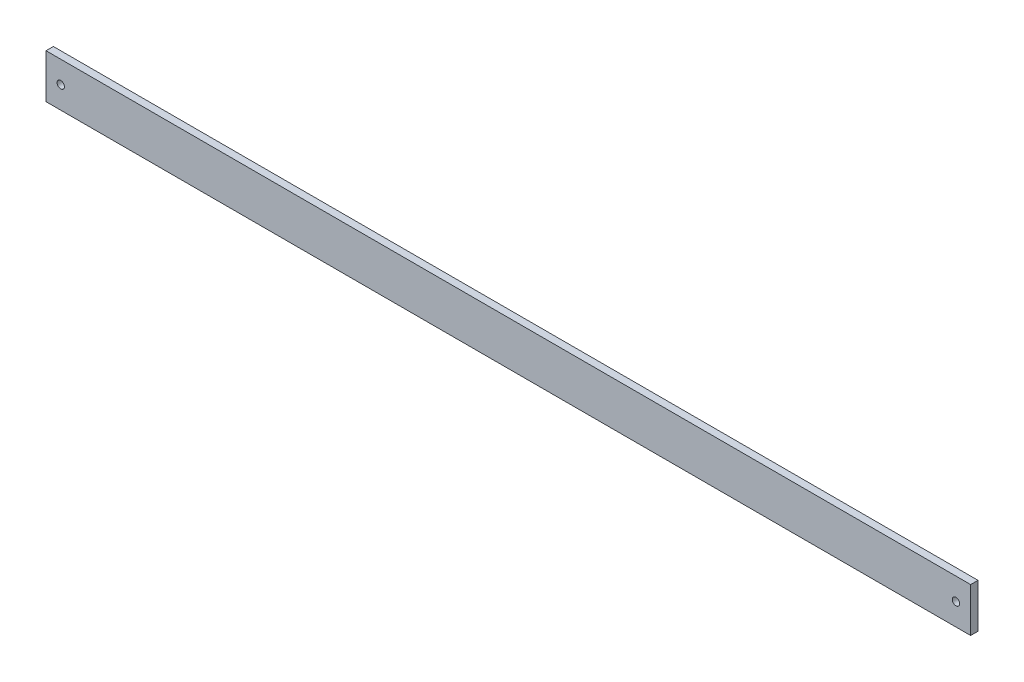
ISO-10303-21;
HEADER;
FILE_DESCRIPTION(('STEP AP214'),'2;1');
FILE_NAME('part.step','',(''),(''),'','','');
FILE_SCHEMA(('AUTOMOTIVE_DESIGN { 1 0 10303 214 1 1 1 1 }'));
ENDSEC;
DATA;
#1=APPLICATION_CONTEXT('core data for automotive mechanical design processes');
#2=APPLICATION_PROTOCOL_DEFINITION('international standard','automotive_design',2000,#1);
#3=PRODUCT_CONTEXT('',#1,'mechanical');
#4=PRODUCT('Part','Part','',(#3));
#5=PRODUCT_RELATED_PRODUCT_CATEGORY('part','',(#4));
#6=PRODUCT_DEFINITION_FORMATION('','',#4);
#7=PRODUCT_DEFINITION_CONTEXT('part definition',#1,'design');
#8=PRODUCT_DEFINITION('design','',#6,#7);
#9=PRODUCT_DEFINITION_SHAPE('','',#8);
#10=(LENGTH_UNIT() NAMED_UNIT(*) SI_UNIT(.MILLI.,.METRE.));
#11=(NAMED_UNIT(*) PLANE_ANGLE_UNIT() SI_UNIT($,.RADIAN.));
#12=(NAMED_UNIT(*) SI_UNIT($,.STERADIAN.) SOLID_ANGLE_UNIT());
#13=UNCERTAINTY_MEASURE_WITH_UNIT(LENGTH_MEASURE(1.E-05),#10,'distance_accuracy_value','');
#14=(GEOMETRIC_REPRESENTATION_CONTEXT(3) GLOBAL_UNCERTAINTY_ASSIGNED_CONTEXT((#13)) GLOBAL_UNIT_ASSIGNED_CONTEXT((#10,
#11,#12)) REPRESENTATION_CONTEXT('',''));
#15=CARTESIAN_POINT('',(0.,0.,0.));
#16=DIRECTION('',(0.,0.,1.));
#17=DIRECTION('',(1.,0.,0.));
#18=AXIS2_PLACEMENT_3D('',#15,#16,#17);
#19=CARTESIAN_POINT('',(0.,0.,3.175));
#20=DIRECTION('',(0.,0.,-1.));
#21=DIRECTION('',(-1.,0.,0.));
#22=AXIS2_PLACEMENT_3D('',#19,#20,#21);
#23=PLANE('',#22);
#24=DIRECTION('',(0.,-1.,0.));
#25=VECTOR('',#24,1.);
#26=CARTESIAN_POINT('',(0.,0.,3.175));
#27=LINE('',#26,#25);
#28=CARTESIAN_POINT('',(0.,19.05,3.175));
#29=VERTEX_POINT('',#28);
#30=CARTESIAN_POINT('',(0.,0.,3.175));
#31=VERTEX_POINT('',#30);
#32=EDGE_CURVE('E89',#29,#31,#27,.T.);
#33=ORIENTED_EDGE('',*,*,#32,.T.);
#34=DIRECTION('',(1.,0.,0.));
#35=VECTOR('',#34,1.);
#36=CARTESIAN_POINT('',(0.,0.,3.175));
#37=LINE('',#36,#35);
#38=CARTESIAN_POINT('',(398.9578,0.,3.175));
#39=VERTEX_POINT('',#38);
#40=EDGE_CURVE('E84',#31,#39,#37,.T.);
#41=ORIENTED_EDGE('',*,*,#40,.T.);
#42=DIRECTION('',(0.,1.,0.));
#43=VECTOR('',#42,1.);
#44=CARTESIAN_POINT('',(398.9578,0.,3.175));
#45=LINE('',#44,#43);
#46=CARTESIAN_POINT('',(398.9578,19.05,3.175));
#47=VERTEX_POINT('',#46);
#48=EDGE_CURVE('E87',#39,#47,#45,.T.);
#49=ORIENTED_EDGE('',*,*,#48,.T.);
#50=DIRECTION('',(-1.,0.,0.));
#51=VECTOR('',#50,1.);
#52=CARTESIAN_POINT('',(0.,19.05,3.175));
#53=LINE('',#52,#51);
#54=EDGE_CURVE('E54',#47,#29,#53,.T.);
#55=ORIENTED_EDGE('',*,*,#54,.T.);
#56=EDGE_LOOP('',(#33,#41,#49,#55));
#57=FACE_BOUND('',#56,.T.);
#58=CARTESIAN_POINT('',(6.35,9.525,3.175));
#59=DIRECTION('',(0.,0.,1.));
#60=DIRECTION('',(1.,0.,0.));
#61=AXIS2_PLACEMENT_3D('',#58,#59,#60);
#62=CIRCLE('',#61,1.5875);
#63=CARTESIAN_POINT('',(7.9375,9.525,3.175));
#64=VERTEX_POINT('',#63);
#65=EDGE_CURVE('E104',#64,#64,#62,.T.);
#66=ORIENTED_EDGE('',*,*,#65,.F.);
#67=EDGE_LOOP('',(#66));
#68=FACE_BOUND('',#67,.T.);
#69=CARTESIAN_POINT('',(392.6078,9.525,3.175));
#70=DIRECTION('',(0.,0.,1.));
#71=DIRECTION('',(1.,0.,0.));
#72=AXIS2_PLACEMENT_3D('',#69,#70,#71);
#73=CIRCLE('',#72,1.58750000000004);
#74=CARTESIAN_POINT('',(394.1953,9.525,3.175));
#75=VERTEX_POINT('',#74);
#76=EDGE_CURVE('E119',#75,#75,#73,.T.);
#77=ORIENTED_EDGE('',*,*,#76,.F.);
#78=EDGE_LOOP('',(#77));
#79=FACE_BOUND('',#78,.T.);
#80=ADVANCED_FACE('F37',(#57,#68,#79),#23,.F.);
#81=CARTESIAN_POINT('',(0.,0.,0.));
#82=DIRECTION('',(0.,0.,-1.));
#83=DIRECTION('',(-1.,0.,0.));
#84=AXIS2_PLACEMENT_3D('',#81,#82,#83);
#85=PLANE('',#84);
#86=CARTESIAN_POINT('',(6.35,9.525,0.));
#87=DIRECTION('',(0.,0.,1.));
#88=DIRECTION('',(1.,0.,0.));
#89=AXIS2_PLACEMENT_3D('',#86,#87,#88);
#90=CIRCLE('',#89,1.5875);
#91=CARTESIAN_POINT('',(7.9375,9.525,0.));
#92=VERTEX_POINT('',#91);
#93=EDGE_CURVE('E116',#92,#92,#90,.T.);
#94=ORIENTED_EDGE('',*,*,#93,.T.);
#95=EDGE_LOOP('',(#94));
#96=FACE_BOUND('',#95,.T.);
#97=DIRECTION('',(0.,-1.,0.));
#98=VECTOR('',#97,1.);
#99=CARTESIAN_POINT('',(0.,0.,0.));
#100=LINE('',#99,#98);
#101=CARTESIAN_POINT('',(0.,19.05,0.));
#102=VERTEX_POINT('',#101);
#103=CARTESIAN_POINT('',(0.,0.,0.));
#104=VERTEX_POINT('',#103);
#105=EDGE_CURVE('E101',#102,#104,#100,.T.);
#106=ORIENTED_EDGE('',*,*,#105,.F.);
#107=DIRECTION('',(-1.,0.,0.));
#108=VECTOR('',#107,1.);
#109=CARTESIAN_POINT('',(0.,19.05,0.));
#110=LINE('',#109,#108);
#111=CARTESIAN_POINT('',(398.9578,19.05,0.));
#112=VERTEX_POINT('',#111);
#113=EDGE_CURVE('E77',#112,#102,#110,.T.);
#114=ORIENTED_EDGE('',*,*,#113,.F.);
#115=DIRECTION('',(0.,1.,0.));
#116=VECTOR('',#115,1.);
#117=CARTESIAN_POINT('',(398.9578,0.,0.));
#118=LINE('',#117,#116);
#119=CARTESIAN_POINT('',(398.9578,0.,0.));
#120=VERTEX_POINT('',#119);
#121=EDGE_CURVE('E71',#120,#112,#118,.T.);
#122=ORIENTED_EDGE('',*,*,#121,.F.);
#123=DIRECTION('',(1.,0.,0.));
#124=VECTOR('',#123,1.);
#125=CARTESIAN_POINT('',(0.,0.,0.));
#126=LINE('',#125,#124);
#127=EDGE_CURVE('E93',#104,#120,#126,.T.);
#128=ORIENTED_EDGE('',*,*,#127,.F.);
#129=EDGE_LOOP('',(#106,#114,#122,#128));
#130=FACE_BOUND('',#129,.T.);
#131=CARTESIAN_POINT('',(392.6078,9.525,0.));
#132=DIRECTION('',(0.,0.,1.));
#133=DIRECTION('',(1.,0.,0.));
#134=AXIS2_PLACEMENT_3D('',#131,#132,#133);
#135=CIRCLE('',#134,1.58750000000004);
#136=CARTESIAN_POINT('',(394.1953,9.525,0.));
#137=VERTEX_POINT('',#136);
#138=EDGE_CURVE('E122',#137,#137,#135,.T.);
#139=ORIENTED_EDGE('',*,*,#138,.T.);
#140=EDGE_LOOP('',(#139));
#141=FACE_BOUND('',#140,.T.);
#142=ADVANCED_FACE('F112',(#96,#130,#141),#85,.T.);
#143=CARTESIAN_POINT('',(0.,0.,3.175));
#144=DIRECTION('',(1.,0.,0.));
#145=DIRECTION('',(0.,0.,-1.));
#146=AXIS2_PLACEMENT_3D('',#143,#144,#145);
#147=PLANE('',#146);
#148=ORIENTED_EDGE('',*,*,#105,.T.);
#149=DIRECTION('',(0.,0.,-1.));
#150=VECTOR('',#149,1.);
#151=CARTESIAN_POINT('',(0.,0.,3.175));
#152=LINE('',#151,#150);
#153=EDGE_CURVE('E11',#31,#104,#152,.T.);
#154=ORIENTED_EDGE('',*,*,#153,.F.);
#155=ORIENTED_EDGE('',*,*,#32,.F.);
#156=DIRECTION('',(0.,0.,-1.));
#157=VECTOR('',#156,1.);
#158=CARTESIAN_POINT('',(0.,19.05,3.175));
#159=LINE('',#158,#157);
#160=EDGE_CURVE('E97',#29,#102,#159,.T.);
#161=ORIENTED_EDGE('',*,*,#160,.T.);
#162=EDGE_LOOP('',(#148,#154,#155,#161));
#163=FACE_BOUND('',#162,.T.);
#164=ADVANCED_FACE('F39',(#163),#147,.F.);
#165=CARTESIAN_POINT('',(0.,0.,3.175));
#166=DIRECTION('',(0.,1.,0.));
#167=DIRECTION('',(0.,0.,1.));
#168=AXIS2_PLACEMENT_3D('',#165,#166,#167);
#169=PLANE('',#168);
#170=ORIENTED_EDGE('',*,*,#127,.T.);
#171=DIRECTION('',(0.,0.,-1.));
#172=VECTOR('',#171,1.);
#173=CARTESIAN_POINT('',(398.9578,0.,3.175));
#174=LINE('',#173,#172);
#175=EDGE_CURVE('E46',#39,#120,#174,.T.);
#176=ORIENTED_EDGE('',*,*,#175,.F.);
#177=ORIENTED_EDGE('',*,*,#40,.F.);
#178=ORIENTED_EDGE('',*,*,#153,.T.);
#179=EDGE_LOOP('',(#170,#176,#177,#178));
#180=FACE_BOUND('',#179,.T.);
#181=ADVANCED_FACE('F92',(#180),#169,.F.);
#182=CARTESIAN_POINT('',(398.9578,0.,3.175));
#183=DIRECTION('',(-1.,0.,0.));
#184=DIRECTION('',(0.,0.,1.));
#185=AXIS2_PLACEMENT_3D('',#182,#183,#184);
#186=PLANE('',#185);
#187=ORIENTED_EDGE('',*,*,#121,.T.);
#188=DIRECTION('',(0.,0.,-1.));
#189=VECTOR('',#188,1.);
#190=CARTESIAN_POINT('',(398.9578,19.05,3.175));
#191=LINE('',#190,#189);
#192=EDGE_CURVE('E94',#47,#112,#191,.T.);
#193=ORIENTED_EDGE('',*,*,#192,.F.);
#194=ORIENTED_EDGE('',*,*,#48,.F.);
#195=ORIENTED_EDGE('',*,*,#175,.T.);
#196=EDGE_LOOP('',(#187,#193,#194,#195));
#197=FACE_BOUND('',#196,.T.);
#198=ADVANCED_FACE('F95',(#197),#186,.F.);
#199=CARTESIAN_POINT('',(0.,19.05,3.175));
#200=DIRECTION('',(0.,-1.,0.));
#201=DIRECTION('',(0.,0.,-1.));
#202=AXIS2_PLACEMENT_3D('',#199,#200,#201);
#203=PLANE('',#202);
#204=ORIENTED_EDGE('',*,*,#113,.T.);
#205=ORIENTED_EDGE('',*,*,#160,.F.);
#206=ORIENTED_EDGE('',*,*,#54,.F.);
#207=ORIENTED_EDGE('',*,*,#192,.T.);
#208=EDGE_LOOP('',(#204,#205,#206,#207));
#209=FACE_BOUND('',#208,.T.);
#210=ADVANCED_FACE('F109',(#209),#203,.F.);
#211=CARTESIAN_POINT('',(6.35,9.525,3.175));
#212=DIRECTION('',(0.,0.,-1.));
#213=DIRECTION('',(-1.,0.,0.));
#214=AXIS2_PLACEMENT_3D('',#211,#212,#213);
#215=CYLINDRICAL_SURFACE('',#214,1.5875);
#216=ORIENTED_EDGE('',*,*,#65,.T.);
#217=EDGE_LOOP('',(#216));
#218=FACE_BOUND('',#217,.T.);
#219=ORIENTED_EDGE('',*,*,#93,.F.);
#220=EDGE_LOOP('',(#219));
#221=FACE_BOUND('',#220,.T.);
#222=ADVANCED_FACE('F139',(#218,#221),#215,.F.);
#223=CARTESIAN_POINT('',(392.6078,9.525,3.175));
#224=DIRECTION('',(0.,0.,-1.));
#225=DIRECTION('',(-1.,0.,0.));
#226=AXIS2_PLACEMENT_3D('',#223,#224,#225);
#227=CYLINDRICAL_SURFACE('',#226,1.58750000000004);
#228=ORIENTED_EDGE('',*,*,#76,.T.);
#229=EDGE_LOOP('',(#228));
#230=FACE_BOUND('',#229,.T.);
#231=ORIENTED_EDGE('',*,*,#138,.F.);
#232=EDGE_LOOP('',(#231));
#233=FACE_BOUND('',#232,.T.);
#234=ADVANCED_FACE('F128',(#230,#233),#227,.F.);
#235=CLOSED_SHELL('',(#80,#142,#164,#181,#198,#210,#222,#234));
#236=MANIFOLD_SOLID_BREP('B2',#235);
#237=ADVANCED_BREP_SHAPE_REPRESENTATION('',(#18,#236),#14);
#238=SHAPE_DEFINITION_REPRESENTATION(#9,#237);
ENDSEC;
END-ISO-10303-21;
